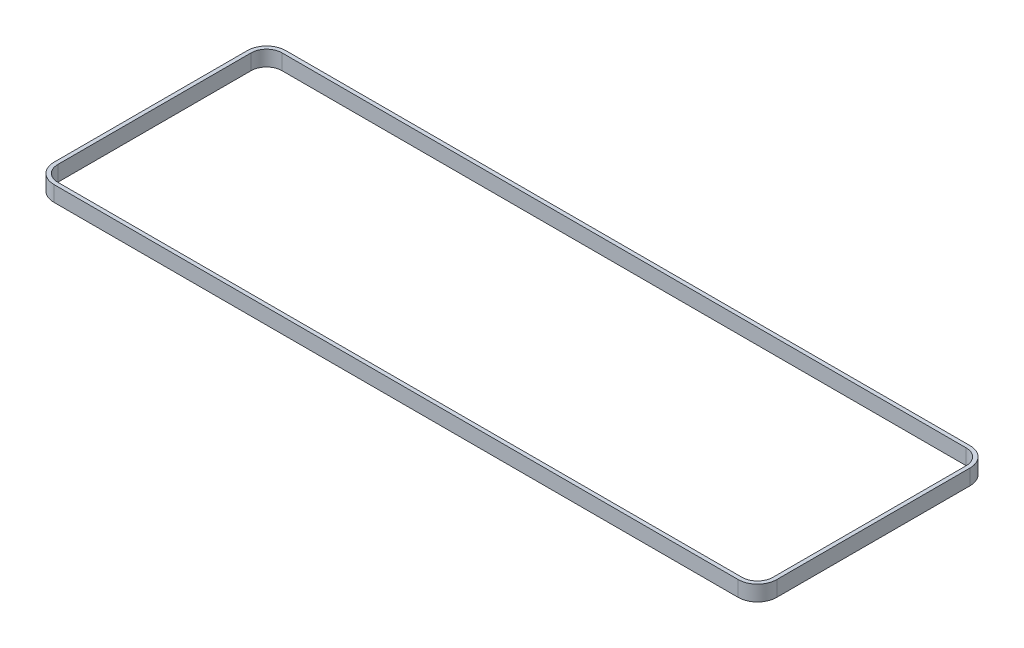
ISO-10303-21;
HEADER;
FILE_DESCRIPTION(('STEP AP214'),'2;1');
FILE_NAME('part.step','',(''),(''),'','','');
FILE_SCHEMA(('AUTOMOTIVE_DESIGN { 1 0 10303 214 1 1 1 1 }'));
ENDSEC;
DATA;
#1=APPLICATION_CONTEXT('core data for automotive mechanical design processes');
#2=APPLICATION_PROTOCOL_DEFINITION('international standard','automotive_design',2000,#1);
#3=PRODUCT_CONTEXT('',#1,'mechanical');
#4=PRODUCT('Part','Part','',(#3));
#5=PRODUCT_RELATED_PRODUCT_CATEGORY('part','',(#4));
#6=PRODUCT_DEFINITION_FORMATION('','',#4);
#7=PRODUCT_DEFINITION_CONTEXT('part definition',#1,'design');
#8=PRODUCT_DEFINITION('design','',#6,#7);
#9=PRODUCT_DEFINITION_SHAPE('','',#8);
#10=(LENGTH_UNIT() NAMED_UNIT(*) SI_UNIT(.MILLI.,.METRE.));
#11=(NAMED_UNIT(*) PLANE_ANGLE_UNIT() SI_UNIT($,.RADIAN.));
#12=(NAMED_UNIT(*) SI_UNIT($,.STERADIAN.) SOLID_ANGLE_UNIT());
#13=UNCERTAINTY_MEASURE_WITH_UNIT(LENGTH_MEASURE(1.E-05),#10,'distance_accuracy_value','');
#14=(GEOMETRIC_REPRESENTATION_CONTEXT(3) GLOBAL_UNCERTAINTY_ASSIGNED_CONTEXT((#13)) GLOBAL_UNIT_ASSIGNED_CONTEXT((#10,
#11,#12)) REPRESENTATION_CONTEXT('',''));
#15=CARTESIAN_POINT('',(0.,0.,0.));
#16=DIRECTION('',(0.,0.,1.));
#17=DIRECTION('',(1.,0.,0.));
#18=AXIS2_PLACEMENT_3D('',#15,#16,#17);
#19=CARTESIAN_POINT('',(-112.395,5.08,-31.75));
#20=DIRECTION('',(0.,1.,0.));
#21=DIRECTION('',(0.,0.,1.));
#22=AXIS2_PLACEMENT_3D('',#19,#20,#21);
#23=PLANE('',#22);
#24=CARTESIAN_POINT('',(-112.395,5.08,-31.75));
#25=DIRECTION('',(0.,1.,0.));
#26=DIRECTION('',(0.,0.,1.));
#27=AXIS2_PLACEMENT_3D('',#24,#25,#26);
#28=CIRCLE('',#27,6.34999999999997);
#29=CARTESIAN_POINT('',(-112.395,5.08,-38.1));
#30=VERTEX_POINT('',#29);
#31=CARTESIAN_POINT('',(-118.745,5.08,-31.75));
#32=VERTEX_POINT('',#31);
#33=EDGE_CURVE('E225',#30,#32,#28,.T.);
#34=ORIENTED_EDGE('',*,*,#33,.T.);
#35=DIRECTION('',(0.,0.,1.));
#36=VECTOR('',#35,1.);
#37=CARTESIAN_POINT('',(-118.745,5.08,31.75));
#38=LINE('',#37,#36);
#39=CARTESIAN_POINT('',(-118.745,5.08,31.75));
#40=VERTEX_POINT('',#39);
#41=EDGE_CURVE('E228',#32,#40,#38,.T.);
#42=ORIENTED_EDGE('',*,*,#41,.T.);
#43=CARTESIAN_POINT('',(-112.395,5.08,31.75));
#44=DIRECTION('',(0.,1.,0.));
#45=DIRECTION('',(0.,0.,-1.));
#46=AXIS2_PLACEMENT_3D('',#43,#44,#45);
#47=CIRCLE('',#46,6.35000000000001);
#48=CARTESIAN_POINT('',(-112.395,5.08,38.1));
#49=VERTEX_POINT('',#48);
#50=EDGE_CURVE('E231',#40,#49,#47,.T.);
#51=ORIENTED_EDGE('',*,*,#50,.T.);
#52=DIRECTION('',(1.,0.,0.));
#53=VECTOR('',#52,1.);
#54=CARTESIAN_POINT('',(-112.395,5.08,38.1));
#55=LINE('',#54,#53);
#56=CARTESIAN_POINT('',(112.395,5.08,38.1));
#57=VERTEX_POINT('',#56);
#58=EDGE_CURVE('E233',#49,#57,#55,.T.);
#59=ORIENTED_EDGE('',*,*,#58,.T.);
#60=CARTESIAN_POINT('',(112.395,5.08,31.75));
#61=DIRECTION('',(0.,1.,0.));
#62=DIRECTION('',(0.,0.,-1.));
#63=AXIS2_PLACEMENT_3D('',#60,#61,#62);
#64=CIRCLE('',#63,6.34999999999999);
#65=CARTESIAN_POINT('',(118.745,5.08,31.75));
#66=VERTEX_POINT('',#65);
#67=EDGE_CURVE('E236',#57,#66,#64,.T.);
#68=ORIENTED_EDGE('',*,*,#67,.T.);
#69=DIRECTION('',(0.,0.,-1.));
#70=VECTOR('',#69,1.);
#71=CARTESIAN_POINT('',(118.745,5.08,31.75));
#72=LINE('',#71,#70);
#73=CARTESIAN_POINT('',(118.745,5.08,-31.75));
#74=VERTEX_POINT('',#73);
#75=EDGE_CURVE('E238',#66,#74,#72,.T.);
#76=ORIENTED_EDGE('',*,*,#75,.T.);
#77=CARTESIAN_POINT('',(112.395,5.08,-31.75));
#78=DIRECTION('',(0.,1.,0.));
#79=DIRECTION('',(0.,0.,-1.));
#80=AXIS2_PLACEMENT_3D('',#77,#78,#79);
#81=CIRCLE('',#80,6.34999999999998);
#82=CARTESIAN_POINT('',(112.395,5.08,-38.1));
#83=VERTEX_POINT('',#82);
#84=EDGE_CURVE('E240',#74,#83,#81,.T.);
#85=ORIENTED_EDGE('',*,*,#84,.T.);
#86=DIRECTION('',(-1.,0.,0.));
#87=VECTOR('',#86,1.);
#88=CARTESIAN_POINT('',(-112.395,5.08,-38.1));
#89=LINE('',#88,#87);
#90=EDGE_CURVE('E242',#83,#30,#89,.T.);
#91=ORIENTED_EDGE('',*,*,#90,.T.);
#92=EDGE_LOOP('',(#34,#42,#51,#59,#68,#76,#85,#91));
#93=FACE_BOUND('',#92,.T.);
#94=DIRECTION('',(-1.,0.,0.));
#95=VECTOR('',#94,1.);
#96=CARTESIAN_POINT('',(-112.395,5.08,-36.83));
#97=LINE('',#96,#95);
#98=CARTESIAN_POINT('',(112.395,5.08,-36.83));
#99=VERTEX_POINT('',#98);
#100=CARTESIAN_POINT('',(-112.395,5.08,-36.83));
#101=VERTEX_POINT('',#100);
#102=EDGE_CURVE('E162',#99,#101,#97,.T.);
#103=ORIENTED_EDGE('',*,*,#102,.F.);
#104=CARTESIAN_POINT('',(112.395,5.08,-31.75));
#105=DIRECTION('',(0.,1.,0.));
#106=DIRECTION('',(0.,0.,-1.));
#107=AXIS2_PLACEMENT_3D('',#104,#105,#106);
#108=CIRCLE('',#107,5.07999999999998);
#109=CARTESIAN_POINT('',(117.475,5.08,-31.75));
#110=VERTEX_POINT('',#109);
#111=EDGE_CURVE('E154',#110,#99,#108,.T.);
#112=ORIENTED_EDGE('',*,*,#111,.F.);
#113=DIRECTION('',(0.,0.,-1.));
#114=VECTOR('',#113,1.);
#115=CARTESIAN_POINT('',(117.475,5.08,31.75));
#116=LINE('',#115,#114);
#117=CARTESIAN_POINT('',(117.475,5.08,31.75));
#118=VERTEX_POINT('',#117);
#119=EDGE_CURVE('E191',#118,#110,#116,.T.);
#120=ORIENTED_EDGE('',*,*,#119,.F.);
#121=CARTESIAN_POINT('',(112.395,5.08,31.75));
#122=DIRECTION('',(0.,1.,0.));
#123=DIRECTION('',(0.,0.,-1.));
#124=AXIS2_PLACEMENT_3D('',#121,#122,#123);
#125=CIRCLE('',#124,5.07999999999999);
#126=CARTESIAN_POINT('',(112.395,5.08,36.83));
#127=VERTEX_POINT('',#126);
#128=EDGE_CURVE('E189',#127,#118,#125,.T.);
#129=ORIENTED_EDGE('',*,*,#128,.F.);
#130=DIRECTION('',(1.,0.,0.));
#131=VECTOR('',#130,1.);
#132=CARTESIAN_POINT('',(-112.395,5.08,36.83));
#133=LINE('',#132,#131);
#134=CARTESIAN_POINT('',(-112.395,5.08,36.83));
#135=VERTEX_POINT('',#134);
#136=EDGE_CURVE('E186',#135,#127,#133,.T.);
#137=ORIENTED_EDGE('',*,*,#136,.F.);
#138=CARTESIAN_POINT('',(-112.395,5.08,31.75));
#139=DIRECTION('',(0.,1.,0.));
#140=DIRECTION('',(0.,0.,-1.));
#141=AXIS2_PLACEMENT_3D('',#138,#139,#140);
#142=CIRCLE('',#141,5.08);
#143=CARTESIAN_POINT('',(-117.475,5.08,31.75));
#144=VERTEX_POINT('',#143);
#145=EDGE_CURVE('E184',#144,#135,#142,.T.);
#146=ORIENTED_EDGE('',*,*,#145,.F.);
#147=DIRECTION('',(0.,0.,1.));
#148=VECTOR('',#147,1.);
#149=CARTESIAN_POINT('',(-117.475,5.08,31.75));
#150=LINE('',#149,#148);
#151=CARTESIAN_POINT('',(-117.475,5.08,-31.75));
#152=VERTEX_POINT('',#151);
#153=EDGE_CURVE('E180',#152,#144,#150,.T.);
#154=ORIENTED_EDGE('',*,*,#153,.F.);
#155=CARTESIAN_POINT('',(-112.395,5.08,-31.75));
#156=DIRECTION('',(0.,1.,0.));
#157=DIRECTION('',(0.,0.,1.));
#158=AXIS2_PLACEMENT_3D('',#155,#156,#157);
#159=CIRCLE('',#158,5.08);
#160=EDGE_CURVE('E175',#101,#152,#159,.T.);
#161=ORIENTED_EDGE('',*,*,#160,.F.);
#162=EDGE_LOOP('',(#103,#112,#120,#129,#137,#146,#154,#161));
#163=FACE_BOUND('',#162,.T.);
#164=ADVANCED_FACE('F41',(#93,#163),#23,.T.);
#165=CARTESIAN_POINT('',(-112.395,0.,-31.75));
#166=DIRECTION('',(0.,1.,0.));
#167=DIRECTION('',(0.,0.,1.));
#168=AXIS2_PLACEMENT_3D('',#165,#166,#167);
#169=PLANE('',#168);
#170=CARTESIAN_POINT('',(-112.395,0.,-31.75));
#171=DIRECTION('',(0.,1.,0.));
#172=DIRECTION('',(0.,0.,1.));
#173=AXIS2_PLACEMENT_3D('',#170,#171,#172);
#174=CIRCLE('',#173,6.34999999999997);
#175=CARTESIAN_POINT('',(-112.395,0.,-38.1));
#176=VERTEX_POINT('',#175);
#177=CARTESIAN_POINT('',(-118.745,0.,-31.75));
#178=VERTEX_POINT('',#177);
#179=EDGE_CURVE('E170',#176,#178,#174,.T.);
#180=ORIENTED_EDGE('',*,*,#179,.F.);
#181=DIRECTION('',(-1.,0.,0.));
#182=VECTOR('',#181,1.);
#183=CARTESIAN_POINT('',(-112.395,0.,-38.1));
#184=LINE('',#183,#182);
#185=CARTESIAN_POINT('',(112.395,0.,-38.1));
#186=VERTEX_POINT('',#185);
#187=EDGE_CURVE('E229',#186,#176,#184,.T.);
#188=ORIENTED_EDGE('',*,*,#187,.F.);
#189=CARTESIAN_POINT('',(112.395,0.,-31.75));
#190=DIRECTION('',(0.,1.,0.));
#191=DIRECTION('',(0.,0.,-1.));
#192=AXIS2_PLACEMENT_3D('',#189,#190,#191);
#193=CIRCLE('',#192,6.34999999999998);
#194=CARTESIAN_POINT('',(118.745,0.,-31.75));
#195=VERTEX_POINT('',#194);
#196=EDGE_CURVE('E258',#195,#186,#193,.T.);
#197=ORIENTED_EDGE('',*,*,#196,.F.);
#198=DIRECTION('',(0.,0.,-1.));
#199=VECTOR('',#198,1.);
#200=CARTESIAN_POINT('',(118.745,0.,31.75));
#201=LINE('',#200,#199);
#202=CARTESIAN_POINT('',(118.745,0.,31.75));
#203=VERTEX_POINT('',#202);
#204=EDGE_CURVE('E256',#203,#195,#201,.T.);
#205=ORIENTED_EDGE('',*,*,#204,.F.);
#206=CARTESIAN_POINT('',(112.395,0.,31.75));
#207=DIRECTION('',(0.,1.,0.));
#208=DIRECTION('',(0.,0.,-1.));
#209=AXIS2_PLACEMENT_3D('',#206,#207,#208);
#210=CIRCLE('',#209,6.34999999999999);
#211=CARTESIAN_POINT('',(112.395,0.,38.1));
#212=VERTEX_POINT('',#211);
#213=EDGE_CURVE('E254',#212,#203,#210,.T.);
#214=ORIENTED_EDGE('',*,*,#213,.F.);
#215=DIRECTION('',(1.,0.,0.));
#216=VECTOR('',#215,1.);
#217=CARTESIAN_POINT('',(-112.395,0.,38.1));
#218=LINE('',#217,#216);
#219=CARTESIAN_POINT('',(-112.395,0.,38.1));
#220=VERTEX_POINT('',#219);
#221=EDGE_CURVE('E251',#220,#212,#218,.T.);
#222=ORIENTED_EDGE('',*,*,#221,.F.);
#223=CARTESIAN_POINT('',(-112.395,0.,31.75));
#224=DIRECTION('',(0.,1.,0.));
#225=DIRECTION('',(0.,0.,-1.));
#226=AXIS2_PLACEMENT_3D('',#223,#224,#225);
#227=CIRCLE('',#226,6.35000000000001);
#228=CARTESIAN_POINT('',(-118.745,0.,31.75));
#229=VERTEX_POINT('',#228);
#230=EDGE_CURVE('E249',#229,#220,#227,.T.);
#231=ORIENTED_EDGE('',*,*,#230,.F.);
#232=DIRECTION('',(0.,0.,1.));
#233=VECTOR('',#232,1.);
#234=CARTESIAN_POINT('',(-118.745,0.,31.75));
#235=LINE('',#234,#233);
#236=EDGE_CURVE('E247',#178,#229,#235,.T.);
#237=ORIENTED_EDGE('',*,*,#236,.F.);
#238=EDGE_LOOP('',(#180,#188,#197,#205,#214,#222,#231,#237));
#239=FACE_BOUND('',#238,.T.);
#240=CARTESIAN_POINT('',(112.395,0.,-31.75));
#241=DIRECTION('',(0.,1.,0.));
#242=DIRECTION('',(0.,0.,-1.));
#243=AXIS2_PLACEMENT_3D('',#240,#241,#242);
#244=CIRCLE('',#243,5.07999999999998);
#245=CARTESIAN_POINT('',(117.475,0.,-31.75));
#246=VERTEX_POINT('',#245);
#247=CARTESIAN_POINT('',(112.395,0.,-36.83));
#248=VERTEX_POINT('',#247);
#249=EDGE_CURVE('E64',#246,#248,#244,.T.);
#250=ORIENTED_EDGE('',*,*,#249,.T.);
#251=DIRECTION('',(-1.,0.,0.));
#252=VECTOR('',#251,1.);
#253=CARTESIAN_POINT('',(-112.395,0.,-36.83));
#254=LINE('',#253,#252);
#255=CARTESIAN_POINT('',(-112.395,0.,-36.83));
#256=VERTEX_POINT('',#255);
#257=EDGE_CURVE('E169',#248,#256,#254,.T.);
#258=ORIENTED_EDGE('',*,*,#257,.T.);
#259=CARTESIAN_POINT('',(-112.395,0.,-31.75));
#260=DIRECTION('',(0.,1.,0.));
#261=DIRECTION('',(0.,0.,1.));
#262=AXIS2_PLACEMENT_3D('',#259,#260,#261);
#263=CIRCLE('',#262,5.08);
#264=CARTESIAN_POINT('',(-117.475,0.,-31.75));
#265=VERTEX_POINT('',#264);
#266=EDGE_CURVE('E196',#256,#265,#263,.T.);
#267=ORIENTED_EDGE('',*,*,#266,.T.);
#268=DIRECTION('',(0.,0.,1.));
#269=VECTOR('',#268,1.);
#270=CARTESIAN_POINT('',(-117.475,0.,31.75));
#271=LINE('',#270,#269);
#272=CARTESIAN_POINT('',(-117.475,0.,31.75));
#273=VERTEX_POINT('',#272);
#274=EDGE_CURVE('E199',#265,#273,#271,.T.);
#275=ORIENTED_EDGE('',*,*,#274,.T.);
#276=CARTESIAN_POINT('',(-112.395,0.,31.75));
#277=DIRECTION('',(0.,1.,0.));
#278=DIRECTION('',(0.,0.,-1.));
#279=AXIS2_PLACEMENT_3D('',#276,#277,#278);
#280=CIRCLE('',#279,5.08);
#281=CARTESIAN_POINT('',(-112.395,0.,36.83));
#282=VERTEX_POINT('',#281);
#283=EDGE_CURVE('E202',#273,#282,#280,.T.);
#284=ORIENTED_EDGE('',*,*,#283,.T.);
#285=DIRECTION('',(1.,0.,0.));
#286=VECTOR('',#285,1.);
#287=CARTESIAN_POINT('',(-112.395,0.,36.83));
#288=LINE('',#287,#286);
#289=CARTESIAN_POINT('',(112.395,0.,36.83));
#290=VERTEX_POINT('',#289);
#291=EDGE_CURVE('E205',#282,#290,#288,.T.);
#292=ORIENTED_EDGE('',*,*,#291,.T.);
#293=CARTESIAN_POINT('',(112.395,0.,31.75));
#294=DIRECTION('',(0.,1.,0.));
#295=DIRECTION('',(0.,0.,-1.));
#296=AXIS2_PLACEMENT_3D('',#293,#294,#295);
#297=CIRCLE('',#296,5.07999999999999);
#298=CARTESIAN_POINT('',(117.475,0.,31.75));
#299=VERTEX_POINT('',#298);
#300=EDGE_CURVE('E209',#290,#299,#297,.T.);
#301=ORIENTED_EDGE('',*,*,#300,.T.);
#302=DIRECTION('',(0.,0.,-1.));
#303=VECTOR('',#302,1.);
#304=CARTESIAN_POINT('',(117.475,0.,31.75));
#305=LINE('',#304,#303);
#306=EDGE_CURVE('E163',#299,#246,#305,.T.);
#307=ORIENTED_EDGE('',*,*,#306,.T.);
#308=EDGE_LOOP('',(#250,#258,#267,#275,#284,#292,#301,#307));
#309=FACE_BOUND('',#308,.T.);
#310=ADVANCED_FACE('F288',(#239,#309),#169,.F.);
#311=CARTESIAN_POINT('',(-112.395,5.08,-31.75));
#312=DIRECTION('',(0.,-1.,0.));
#313=DIRECTION('',(0.,0.,-1.));
#314=AXIS2_PLACEMENT_3D('',#311,#312,#313);
#315=CYLINDRICAL_SURFACE('',#314,6.34999999999997);
#316=ORIENTED_EDGE('',*,*,#179,.T.);
#317=DIRECTION('',(0.,-1.,0.));
#318=VECTOR('',#317,1.);
#319=CARTESIAN_POINT('',(-118.745,5.08,-31.75));
#320=LINE('',#319,#318);
#321=EDGE_CURVE('E11',#32,#178,#320,.T.);
#322=ORIENTED_EDGE('',*,*,#321,.F.);
#323=ORIENTED_EDGE('',*,*,#33,.F.);
#324=DIRECTION('',(0.,-1.,0.));
#325=VECTOR('',#324,1.);
#326=CARTESIAN_POINT('',(-112.395,5.08,-38.1));
#327=LINE('',#326,#325);
#328=EDGE_CURVE('E244',#30,#176,#327,.T.);
#329=ORIENTED_EDGE('',*,*,#328,.T.);
#330=EDGE_LOOP('',(#316,#322,#323,#329));
#331=FACE_BOUND('',#330,.T.);
#332=ADVANCED_FACE('F43',(#331),#315,.T.);
#333=CARTESIAN_POINT('',(-118.745,5.08,31.75));
#334=DIRECTION('',(1.,0.,0.));
#335=DIRECTION('',(0.,0.,-1.));
#336=AXIS2_PLACEMENT_3D('',#333,#334,#335);
#337=PLANE('',#336);
#338=ORIENTED_EDGE('',*,*,#236,.T.);
#339=DIRECTION('',(0.,-1.,0.));
#340=VECTOR('',#339,1.);
#341=CARTESIAN_POINT('',(-118.745,5.08,31.75));
#342=LINE('',#341,#340);
#343=EDGE_CURVE('E49',#40,#229,#342,.T.);
#344=ORIENTED_EDGE('',*,*,#343,.F.);
#345=ORIENTED_EDGE('',*,*,#41,.F.);
#346=ORIENTED_EDGE('',*,*,#321,.T.);
#347=EDGE_LOOP('',(#338,#344,#345,#346));
#348=FACE_BOUND('',#347,.T.);
#349=ADVANCED_FACE('F305',(#348),#337,.F.);
#350=CARTESIAN_POINT('',(-112.395,5.08,31.75));
#351=DIRECTION('',(0.,-1.,0.));
#352=DIRECTION('',(0.,0.,-1.));
#353=AXIS2_PLACEMENT_3D('',#350,#351,#352);
#354=CYLINDRICAL_SURFACE('',#353,6.35000000000001);
#355=ORIENTED_EDGE('',*,*,#230,.T.);
#356=DIRECTION('',(0.,-1.,0.));
#357=VECTOR('',#356,1.);
#358=CARTESIAN_POINT('',(-112.395,5.08,38.1));
#359=LINE('',#358,#357);
#360=EDGE_CURVE('E275',#49,#220,#359,.T.);
#361=ORIENTED_EDGE('',*,*,#360,.F.);
#362=ORIENTED_EDGE('',*,*,#50,.F.);
#363=ORIENTED_EDGE('',*,*,#343,.T.);
#364=EDGE_LOOP('',(#355,#361,#362,#363));
#365=FACE_BOUND('',#364,.T.);
#366=ADVANCED_FACE('F282',(#365),#354,.T.);
#367=CARTESIAN_POINT('',(-112.395,5.08,38.1));
#368=DIRECTION('',(0.,0.,-1.));
#369=DIRECTION('',(-1.,0.,0.));
#370=AXIS2_PLACEMENT_3D('',#367,#368,#369);
#371=PLANE('',#370);
#372=ORIENTED_EDGE('',*,*,#221,.T.);
#373=DIRECTION('',(0.,-1.,0.));
#374=VECTOR('',#373,1.);
#375=CARTESIAN_POINT('',(112.395,5.08,38.1));
#376=LINE('',#375,#374);
#377=EDGE_CURVE('E272',#57,#212,#376,.T.);
#378=ORIENTED_EDGE('',*,*,#377,.F.);
#379=ORIENTED_EDGE('',*,*,#58,.F.);
#380=ORIENTED_EDGE('',*,*,#360,.T.);
#381=EDGE_LOOP('',(#372,#378,#379,#380));
#382=FACE_BOUND('',#381,.T.);
#383=ADVANCED_FACE('F294',(#382),#371,.F.);
#384=CARTESIAN_POINT('',(112.395,5.08,31.75));
#385=DIRECTION('',(0.,-1.,0.));
#386=DIRECTION('',(0.,0.,-1.));
#387=AXIS2_PLACEMENT_3D('',#384,#385,#386);
#388=CYLINDRICAL_SURFACE('',#387,6.34999999999999);
#389=ORIENTED_EDGE('',*,*,#213,.T.);
#390=DIRECTION('',(0.,-1.,0.));
#391=VECTOR('',#390,1.);
#392=CARTESIAN_POINT('',(118.745,5.08,31.75));
#393=LINE('',#392,#391);
#394=EDGE_CURVE('E269',#66,#203,#393,.T.);
#395=ORIENTED_EDGE('',*,*,#394,.F.);
#396=ORIENTED_EDGE('',*,*,#67,.F.);
#397=ORIENTED_EDGE('',*,*,#377,.T.);
#398=EDGE_LOOP('',(#389,#395,#396,#397));
#399=FACE_BOUND('',#398,.T.);
#400=ADVANCED_FACE('F298',(#399),#388,.T.);
#401=CARTESIAN_POINT('',(118.745,5.08,31.75));
#402=DIRECTION('',(-1.,0.,0.));
#403=DIRECTION('',(0.,0.,1.));
#404=AXIS2_PLACEMENT_3D('',#401,#402,#403);
#405=PLANE('',#404);
#406=ORIENTED_EDGE('',*,*,#204,.T.);
#407=DIRECTION('',(0.,-1.,0.));
#408=VECTOR('',#407,1.);
#409=CARTESIAN_POINT('',(118.745,5.08,-31.75));
#410=LINE('',#409,#408);
#411=EDGE_CURVE('E266',#74,#195,#410,.T.);
#412=ORIENTED_EDGE('',*,*,#411,.F.);
#413=ORIENTED_EDGE('',*,*,#75,.F.);
#414=ORIENTED_EDGE('',*,*,#394,.T.);
#415=EDGE_LOOP('',(#406,#412,#413,#414));
#416=FACE_BOUND('',#415,.T.);
#417=ADVANCED_FACE('F318',(#416),#405,.F.);
#418=CARTESIAN_POINT('',(112.395,5.08,-31.75));
#419=DIRECTION('',(0.,-1.,0.));
#420=DIRECTION('',(0.,0.,-1.));
#421=AXIS2_PLACEMENT_3D('',#418,#419,#420);
#422=CYLINDRICAL_SURFACE('',#421,6.34999999999998);
#423=ORIENTED_EDGE('',*,*,#196,.T.);
#424=DIRECTION('',(0.,-1.,0.));
#425=VECTOR('',#424,1.);
#426=CARTESIAN_POINT('',(112.395,5.08,-38.1));
#427=LINE('',#426,#425);
#428=EDGE_CURVE('E263',#83,#186,#427,.T.);
#429=ORIENTED_EDGE('',*,*,#428,.F.);
#430=ORIENTED_EDGE('',*,*,#84,.F.);
#431=ORIENTED_EDGE('',*,*,#411,.T.);
#432=EDGE_LOOP('',(#423,#429,#430,#431));
#433=FACE_BOUND('',#432,.T.);
#434=ADVANCED_FACE('F316',(#433),#422,.T.);
#435=CARTESIAN_POINT('',(-112.395,5.08,-38.1));
#436=DIRECTION('',(0.,0.,1.));
#437=DIRECTION('',(1.,0.,0.));
#438=AXIS2_PLACEMENT_3D('',#435,#436,#437);
#439=PLANE('',#438);
#440=ORIENTED_EDGE('',*,*,#187,.T.);
#441=ORIENTED_EDGE('',*,*,#328,.F.);
#442=ORIENTED_EDGE('',*,*,#90,.F.);
#443=ORIENTED_EDGE('',*,*,#428,.T.);
#444=EDGE_LOOP('',(#440,#441,#442,#443));
#445=FACE_BOUND('',#444,.T.);
#446=ADVANCED_FACE('F311',(#445),#439,.F.);
#447=CARTESIAN_POINT('',(112.395,5.08,-31.75));
#448=DIRECTION('',(0.,-1.,0.));
#449=DIRECTION('',(0.,0.,-1.));
#450=AXIS2_PLACEMENT_3D('',#447,#448,#449);
#451=CYLINDRICAL_SURFACE('',#450,5.07999999999998);
#452=ORIENTED_EDGE('',*,*,#249,.F.);
#453=DIRECTION('',(0.,-1.,0.));
#454=VECTOR('',#453,1.);
#455=CARTESIAN_POINT('',(117.475,5.08,-31.75));
#456=LINE('',#455,#454);
#457=EDGE_CURVE('E158',#110,#246,#456,.T.);
#458=ORIENTED_EDGE('',*,*,#457,.F.);
#459=ORIENTED_EDGE('',*,*,#111,.T.);
#460=DIRECTION('',(0.,-1.,0.));
#461=VECTOR('',#460,1.);
#462=CARTESIAN_POINT('',(112.395,5.08,-36.83));
#463=LINE('',#462,#461);
#464=EDGE_CURVE('E157',#99,#248,#463,.T.);
#465=ORIENTED_EDGE('',*,*,#464,.T.);
#466=EDGE_LOOP('',(#452,#458,#459,#465));
#467=FACE_BOUND('',#466,.T.);
#468=ADVANCED_FACE('F156',(#467),#451,.F.);
#469=CARTESIAN_POINT('',(-112.395,5.08,-36.83));
#470=DIRECTION('',(0.,0.,1.));
#471=DIRECTION('',(1.,0.,0.));
#472=AXIS2_PLACEMENT_3D('',#469,#470,#471);
#473=PLANE('',#472);
#474=ORIENTED_EDGE('',*,*,#257,.F.);
#475=ORIENTED_EDGE('',*,*,#464,.F.);
#476=ORIENTED_EDGE('',*,*,#102,.T.);
#477=DIRECTION('',(0.,-1.,0.));
#478=VECTOR('',#477,1.);
#479=CARTESIAN_POINT('',(-112.395,5.08,-36.83));
#480=LINE('',#479,#478);
#481=EDGE_CURVE('E171',#101,#256,#480,.T.);
#482=ORIENTED_EDGE('',*,*,#481,.T.);
#483=EDGE_LOOP('',(#474,#475,#476,#482));
#484=FACE_BOUND('',#483,.T.);
#485=ADVANCED_FACE('F166',(#484),#473,.T.);
#486=CARTESIAN_POINT('',(-112.395,5.08,-31.75));
#487=DIRECTION('',(0.,-1.,0.));
#488=DIRECTION('',(0.,0.,-1.));
#489=AXIS2_PLACEMENT_3D('',#486,#487,#488);
#490=CYLINDRICAL_SURFACE('',#489,5.08);
#491=ORIENTED_EDGE('',*,*,#266,.F.);
#492=ORIENTED_EDGE('',*,*,#481,.F.);
#493=ORIENTED_EDGE('',*,*,#160,.T.);
#494=DIRECTION('',(0.,-1.,0.));
#495=VECTOR('',#494,1.);
#496=CARTESIAN_POINT('',(-117.475,5.08,-31.75));
#497=LINE('',#496,#495);
#498=EDGE_CURVE('E222',#152,#265,#497,.T.);
#499=ORIENTED_EDGE('',*,*,#498,.T.);
#500=EDGE_LOOP('',(#491,#492,#493,#499));
#501=FACE_BOUND('',#500,.T.);
#502=ADVANCED_FACE('F343',(#501),#490,.F.);
#503=CARTESIAN_POINT('',(-117.475,5.08,31.75));
#504=DIRECTION('',(1.,0.,0.));
#505=DIRECTION('',(0.,0.,-1.));
#506=AXIS2_PLACEMENT_3D('',#503,#504,#505);
#507=PLANE('',#506);
#508=ORIENTED_EDGE('',*,*,#274,.F.);
#509=ORIENTED_EDGE('',*,*,#498,.F.);
#510=ORIENTED_EDGE('',*,*,#153,.T.);
#511=DIRECTION('',(0.,-1.,0.));
#512=VECTOR('',#511,1.);
#513=CARTESIAN_POINT('',(-117.475,5.08,31.75));
#514=LINE('',#513,#512);
#515=EDGE_CURVE('E220',#144,#273,#514,.T.);
#516=ORIENTED_EDGE('',*,*,#515,.T.);
#517=EDGE_LOOP('',(#508,#509,#510,#516));
#518=FACE_BOUND('',#517,.T.);
#519=ADVANCED_FACE('F347',(#518),#507,.T.);
#520=CARTESIAN_POINT('',(-112.395,5.08,31.75));
#521=DIRECTION('',(0.,-1.,0.));
#522=DIRECTION('',(0.,0.,-1.));
#523=AXIS2_PLACEMENT_3D('',#520,#521,#522);
#524=CYLINDRICAL_SURFACE('',#523,5.08);
#525=ORIENTED_EDGE('',*,*,#283,.F.);
#526=ORIENTED_EDGE('',*,*,#515,.F.);
#527=ORIENTED_EDGE('',*,*,#145,.T.);
#528=DIRECTION('',(0.,-1.,0.));
#529=VECTOR('',#528,1.);
#530=CARTESIAN_POINT('',(-112.395,5.08,36.83));
#531=LINE('',#530,#529);
#532=EDGE_CURVE('E218',#135,#282,#531,.T.);
#533=ORIENTED_EDGE('',*,*,#532,.T.);
#534=EDGE_LOOP('',(#525,#526,#527,#533));
#535=FACE_BOUND('',#534,.T.);
#536=ADVANCED_FACE('F353',(#535),#524,.F.);
#537=CARTESIAN_POINT('',(-112.395,5.08,36.83));
#538=DIRECTION('',(0.,0.,-1.));
#539=DIRECTION('',(-1.,0.,0.));
#540=AXIS2_PLACEMENT_3D('',#537,#538,#539);
#541=PLANE('',#540);
#542=ORIENTED_EDGE('',*,*,#291,.F.);
#543=ORIENTED_EDGE('',*,*,#532,.F.);
#544=ORIENTED_EDGE('',*,*,#136,.T.);
#545=DIRECTION('',(0.,-1.,0.));
#546=VECTOR('',#545,1.);
#547=CARTESIAN_POINT('',(112.395,5.08,36.83));
#548=LINE('',#547,#546);
#549=EDGE_CURVE('E216',#127,#290,#548,.T.);
#550=ORIENTED_EDGE('',*,*,#549,.T.);
#551=EDGE_LOOP('',(#542,#543,#544,#550));
#552=FACE_BOUND('',#551,.T.);
#553=ADVANCED_FACE('F357',(#552),#541,.T.);
#554=CARTESIAN_POINT('',(112.395,5.08,31.75));
#555=DIRECTION('',(0.,-1.,0.));
#556=DIRECTION('',(0.,0.,-1.));
#557=AXIS2_PLACEMENT_3D('',#554,#555,#556);
#558=CYLINDRICAL_SURFACE('',#557,5.07999999999999);
#559=ORIENTED_EDGE('',*,*,#300,.F.);
#560=ORIENTED_EDGE('',*,*,#549,.F.);
#561=ORIENTED_EDGE('',*,*,#128,.T.);
#562=DIRECTION('',(0.,-1.,0.));
#563=VECTOR('',#562,1.);
#564=CARTESIAN_POINT('',(117.475,5.08,31.75));
#565=LINE('',#564,#563);
#566=EDGE_CURVE('E56',#118,#299,#565,.T.);
#567=ORIENTED_EDGE('',*,*,#566,.T.);
#568=EDGE_LOOP('',(#559,#560,#561,#567));
#569=FACE_BOUND('',#568,.T.);
#570=ADVANCED_FACE('F361',(#569),#558,.F.);
#571=CARTESIAN_POINT('',(117.475,5.08,31.75));
#572=DIRECTION('',(-1.,0.,0.));
#573=DIRECTION('',(0.,0.,1.));
#574=AXIS2_PLACEMENT_3D('',#571,#572,#573);
#575=PLANE('',#574);
#576=ORIENTED_EDGE('',*,*,#306,.F.);
#577=ORIENTED_EDGE('',*,*,#566,.F.);
#578=ORIENTED_EDGE('',*,*,#119,.T.);
#579=ORIENTED_EDGE('',*,*,#457,.T.);
#580=EDGE_LOOP('',(#576,#577,#578,#579));
#581=FACE_BOUND('',#580,.T.);
#582=ADVANCED_FACE('F365',(#581),#575,.T.);
#583=CLOSED_SHELL('',(#164,#310,#332,#349,#366,#383,#400,#417,#434,#446,#468,#485,#502,#519,
#536,#553,#570,#582));
#584=MANIFOLD_SOLID_BREP('B2',#583);
#585=ADVANCED_BREP_SHAPE_REPRESENTATION('',(#18,#584),#14);
#586=SHAPE_DEFINITION_REPRESENTATION(#9,#585);
ENDSEC;
END-ISO-10303-21;
